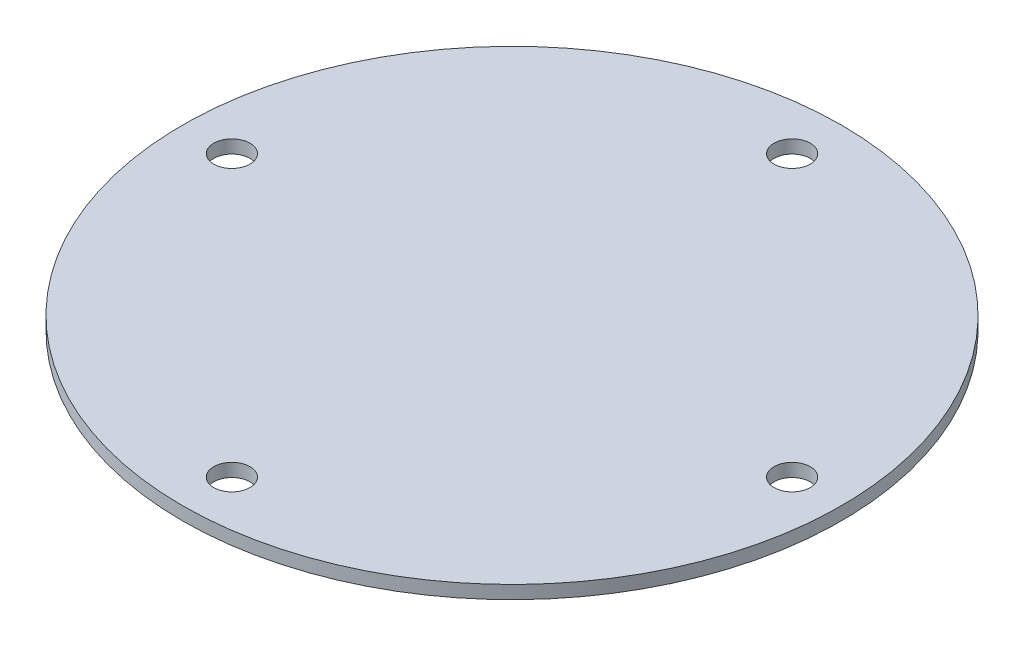
ISO-10303-21;
HEADER;
FILE_DESCRIPTION(('STEP AP214'),'2;1');
FILE_NAME('part.step','',(''),(''),'','','');
FILE_SCHEMA(('AUTOMOTIVE_DESIGN { 1 0 10303 214 1 1 1 1 }'));
ENDSEC;
DATA;
#1=APPLICATION_CONTEXT('core data for automotive mechanical design processes');
#2=APPLICATION_PROTOCOL_DEFINITION('international standard','automotive_design',2000,#1);
#3=PRODUCT_CONTEXT('',#1,'mechanical');
#4=PRODUCT('Part','Part','',(#3));
#5=PRODUCT_RELATED_PRODUCT_CATEGORY('part','',(#4));
#6=PRODUCT_DEFINITION_FORMATION('','',#4);
#7=PRODUCT_DEFINITION_CONTEXT('part definition',#1,'design');
#8=PRODUCT_DEFINITION('design','',#6,#7);
#9=PRODUCT_DEFINITION_SHAPE('','',#8);
#10=(LENGTH_UNIT() NAMED_UNIT(*) SI_UNIT(.MILLI.,.METRE.));
#11=(NAMED_UNIT(*) PLANE_ANGLE_UNIT() SI_UNIT($,.RADIAN.));
#12=(NAMED_UNIT(*) SI_UNIT($,.STERADIAN.) SOLID_ANGLE_UNIT());
#13=UNCERTAINTY_MEASURE_WITH_UNIT(LENGTH_MEASURE(1.E-05),#10,'distance_accuracy_value','');
#14=(GEOMETRIC_REPRESENTATION_CONTEXT(3) GLOBAL_UNCERTAINTY_ASSIGNED_CONTEXT((#13)) GLOBAL_UNIT_ASSIGNED_CONTEXT((#10,
#11,#12)) REPRESENTATION_CONTEXT('',''));
#15=CARTESIAN_POINT('',(0.,0.,0.));
#16=DIRECTION('',(0.,0.,1.));
#17=DIRECTION('',(1.,0.,0.));
#18=AXIS2_PLACEMENT_3D('',#15,#16,#17);
#19=CARTESIAN_POINT('',(0.,2.,0.));
#20=DIRECTION('',(0.,1.,0.));
#21=DIRECTION('',(0.,0.,1.));
#22=AXIS2_PLACEMENT_3D('',#19,#20,#21);
#23=PLANE('',#22);
#24=CARTESIAN_POINT('',(2.40023105489521E-12,2.,42.5));
#25=DIRECTION('',(0.,1.,0.));
#26=DIRECTION('',(0.,0.,1.));
#27=AXIS2_PLACEMENT_3D('',#24,#25,#26);
#28=CIRCLE('',#27,2.75000000000258);
#29=CARTESIAN_POINT('',(2.40023105489521E-12,2.,45.2500000000026));
#30=VERTEX_POINT('',#29);
#31=EDGE_CURVE('E68',#30,#30,#28,.T.);
#32=ORIENTED_EDGE('',*,*,#31,.F.);
#33=EDGE_LOOP('',(#32));
#34=FACE_BOUND('',#33,.T.);
#35=CARTESIAN_POINT('',(0.,2.,-42.5));
#36=DIRECTION('',(0.,1.,0.));
#37=DIRECTION('',(0.,0.,1.));
#38=AXIS2_PLACEMENT_3D('',#35,#36,#37);
#39=CIRCLE('',#38,2.75);
#40=CARTESIAN_POINT('',(0.,2.,-39.75));
#41=VERTEX_POINT('',#40);
#42=EDGE_CURVE('E54',#41,#41,#39,.T.);
#43=ORIENTED_EDGE('',*,*,#42,.F.);
#44=EDGE_LOOP('',(#43));
#45=FACE_BOUND('',#44,.T.);
#46=CARTESIAN_POINT('',(0.,2.,0.));
#47=DIRECTION('',(0.,1.,0.));
#48=DIRECTION('',(0.,0.,1.));
#49=AXIS2_PLACEMENT_3D('',#46,#47,#48);
#50=CIRCLE('',#49,50.);
#51=CARTESIAN_POINT('',(0.,2.,50.));
#52=VERTEX_POINT('',#51);
#53=EDGE_CURVE('E10',#52,#52,#50,.T.);
#54=ORIENTED_EDGE('',*,*,#53,.T.);
#55=EDGE_LOOP('',(#54));
#56=FACE_BOUND('',#55,.T.);
#57=CARTESIAN_POINT('',(42.5000000000012,2.,-1.20011552744761E-12));
#58=DIRECTION('',(0.,1.,0.));
#59=DIRECTION('',(0.,0.,1.));
#60=AXIS2_PLACEMENT_3D('',#57,#58,#59);
#61=CIRCLE('',#60,2.75000000000095);
#62=CARTESIAN_POINT('',(42.5000000000012,2.,2.74999999999975));
#63=VERTEX_POINT('',#62);
#64=EDGE_CURVE('E60',#63,#63,#61,.T.);
#65=ORIENTED_EDGE('',*,*,#64,.F.);
#66=EDGE_LOOP('',(#65));
#67=FACE_BOUND('',#66,.T.);
#68=CARTESIAN_POINT('',(-42.4999999999988,2.,1.20532027634398E-12));
#69=DIRECTION('',(0.,1.,0.));
#70=DIRECTION('',(0.,0.,1.));
#71=AXIS2_PLACEMENT_3D('',#68,#69,#70);
#72=CIRCLE('',#71,2.75000000000193);
#73=CARTESIAN_POINT('',(-42.4999999999988,2.,2.75000000000314));
#74=VERTEX_POINT('',#73);
#75=EDGE_CURVE('E76',#74,#74,#72,.T.);
#76=ORIENTED_EDGE('',*,*,#75,.F.);
#77=EDGE_LOOP('',(#76));
#78=FACE_BOUND('',#77,.T.);
#79=ADVANCED_FACE('F41',(#34,#45,#56,#67,#78),#23,.T.);
#80=CARTESIAN_POINT('',(0.,0.,0.));
#81=DIRECTION('',(0.,1.,0.));
#82=DIRECTION('',(0.,0.,1.));
#83=AXIS2_PLACEMENT_3D('',#80,#81,#82);
#84=PLANE('',#83);
#85=CARTESIAN_POINT('',(0.,0.,0.));
#86=DIRECTION('',(0.,1.,0.));
#87=DIRECTION('',(0.,0.,1.));
#88=AXIS2_PLACEMENT_3D('',#85,#86,#87);
#89=CIRCLE('',#88,50.);
#90=CARTESIAN_POINT('',(0.,0.,50.));
#91=VERTEX_POINT('',#90);
#92=EDGE_CURVE('E45',#91,#91,#89,.T.);
#93=ORIENTED_EDGE('',*,*,#92,.F.);
#94=EDGE_LOOP('',(#93));
#95=FACE_BOUND('',#94,.T.);
#96=CARTESIAN_POINT('',(0.,0.,-42.5));
#97=DIRECTION('',(0.,1.,0.));
#98=DIRECTION('',(0.,0.,1.));
#99=AXIS2_PLACEMENT_3D('',#96,#97,#98);
#100=CIRCLE('',#99,2.75);
#101=CARTESIAN_POINT('',(0.,0.,-39.75));
#102=VERTEX_POINT('',#101);
#103=EDGE_CURVE('E56',#102,#102,#100,.T.);
#104=ORIENTED_EDGE('',*,*,#103,.T.);
#105=EDGE_LOOP('',(#104));
#106=FACE_BOUND('',#105,.T.);
#107=CARTESIAN_POINT('',(42.5000000000012,0.,-1.20011552744761E-12));
#108=DIRECTION('',(0.,1.,0.));
#109=DIRECTION('',(0.,0.,1.));
#110=AXIS2_PLACEMENT_3D('',#107,#108,#109);
#111=CIRCLE('',#110,2.75000000000095);
#112=CARTESIAN_POINT('',(42.5000000000012,0.,2.74999999999975));
#113=VERTEX_POINT('',#112);
#114=EDGE_CURVE('E64',#113,#113,#111,.T.);
#115=ORIENTED_EDGE('',*,*,#114,.T.);
#116=EDGE_LOOP('',(#115));
#117=FACE_BOUND('',#116,.T.);
#118=CARTESIAN_POINT('',(2.40023105489521E-12,0.,42.5));
#119=DIRECTION('',(0.,1.,0.));
#120=DIRECTION('',(0.,0.,1.));
#121=AXIS2_PLACEMENT_3D('',#118,#119,#120);
#122=CIRCLE('',#121,2.75000000000258);
#123=CARTESIAN_POINT('',(2.40023105489521E-12,0.,45.2500000000026));
#124=VERTEX_POINT('',#123);
#125=EDGE_CURVE('E72',#124,#124,#122,.T.);
#126=ORIENTED_EDGE('',*,*,#125,.T.);
#127=EDGE_LOOP('',(#126));
#128=FACE_BOUND('',#127,.T.);
#129=CARTESIAN_POINT('',(-42.4999999999988,0.,1.20532027634398E-12));
#130=DIRECTION('',(0.,1.,0.));
#131=DIRECTION('',(0.,0.,1.));
#132=AXIS2_PLACEMENT_3D('',#129,#130,#131);
#133=CIRCLE('',#132,2.75000000000193);
#134=CARTESIAN_POINT('',(-42.4999999999988,0.,2.75000000000314));
#135=VERTEX_POINT('',#134);
#136=EDGE_CURVE('E80',#135,#135,#133,.T.);
#137=ORIENTED_EDGE('',*,*,#136,.T.);
#138=EDGE_LOOP('',(#137));
#139=FACE_BOUND('',#138,.T.);
#140=ADVANCED_FACE('F92',(#95,#106,#117,#128,#139),#84,.F.);
#141=CARTESIAN_POINT('',(0.,2.,0.));
#142=DIRECTION('',(0.,-1.,0.));
#143=DIRECTION('',(0.,0.,-1.));
#144=AXIS2_PLACEMENT_3D('',#141,#142,#143);
#145=CYLINDRICAL_SURFACE('',#144,50.);
#146=ORIENTED_EDGE('',*,*,#53,.F.);
#147=EDGE_LOOP('',(#146));
#148=FACE_BOUND('',#147,.T.);
#149=ORIENTED_EDGE('',*,*,#92,.T.);
#150=EDGE_LOOP('',(#149));
#151=FACE_BOUND('',#150,.T.);
#152=ADVANCED_FACE('F43',(#148,#151),#145,.T.);
#153=CARTESIAN_POINT('',(0.,2.,-42.5));
#154=DIRECTION('',(0.,-1.,0.));
#155=DIRECTION('',(0.,0.,-1.));
#156=AXIS2_PLACEMENT_3D('',#153,#154,#155);
#157=CYLINDRICAL_SURFACE('',#156,2.75);
#158=ORIENTED_EDGE('',*,*,#42,.T.);
#159=EDGE_LOOP('',(#158));
#160=FACE_BOUND('',#159,.T.);
#161=ORIENTED_EDGE('',*,*,#103,.F.);
#162=EDGE_LOOP('',(#161));
#163=FACE_BOUND('',#162,.T.);
#164=ADVANCED_FACE('F102',(#160,#163),#157,.F.);
#165=CARTESIAN_POINT('',(42.5000000000012,2.,-1.20011552744761E-12));
#166=DIRECTION('',(0.,-1.,0.));
#167=DIRECTION('',(0.,0.,-1.));
#168=AXIS2_PLACEMENT_3D('',#165,#166,#167);
#169=CYLINDRICAL_SURFACE('',#168,2.75000000000095);
#170=ORIENTED_EDGE('',*,*,#64,.T.);
#171=EDGE_LOOP('',(#170));
#172=FACE_BOUND('',#171,.T.);
#173=ORIENTED_EDGE('',*,*,#114,.F.);
#174=EDGE_LOOP('',(#173));
#175=FACE_BOUND('',#174,.T.);
#176=ADVANCED_FACE('F105',(#172,#175),#169,.F.);
#177=CARTESIAN_POINT('',(2.40023105489521E-12,2.,42.5));
#178=DIRECTION('',(0.,-1.,0.));
#179=DIRECTION('',(0.,0.,-1.));
#180=AXIS2_PLACEMENT_3D('',#177,#178,#179);
#181=CYLINDRICAL_SURFACE('',#180,2.75000000000258);
#182=ORIENTED_EDGE('',*,*,#31,.T.);
#183=EDGE_LOOP('',(#182));
#184=FACE_BOUND('',#183,.T.);
#185=ORIENTED_EDGE('',*,*,#125,.F.);
#186=EDGE_LOOP('',(#185));
#187=FACE_BOUND('',#186,.T.);
#188=ADVANCED_FACE('F109',(#184,#187),#181,.F.);
#189=CARTESIAN_POINT('',(-42.4999999999988,2.,1.20532027634398E-12));
#190=DIRECTION('',(0.,-1.,0.));
#191=DIRECTION('',(0.,0.,-1.));
#192=AXIS2_PLACEMENT_3D('',#189,#190,#191);
#193=CYLINDRICAL_SURFACE('',#192,2.75000000000193);
#194=ORIENTED_EDGE('',*,*,#75,.T.);
#195=EDGE_LOOP('',(#194));
#196=FACE_BOUND('',#195,.T.);
#197=ORIENTED_EDGE('',*,*,#136,.F.);
#198=EDGE_LOOP('',(#197));
#199=FACE_BOUND('',#198,.T.);
#200=ADVANCED_FACE('F88',(#196,#199),#193,.F.);
#201=CLOSED_SHELL('',(#79,#140,#152,#164,#176,#188,#200));
#202=MANIFOLD_SOLID_BREP('B2',#201);
#203=ADVANCED_BREP_SHAPE_REPRESENTATION('',(#18,#202),#14);
#204=SHAPE_DEFINITION_REPRESENTATION(#9,#203);
ENDSEC;
END-ISO-10303-21;
